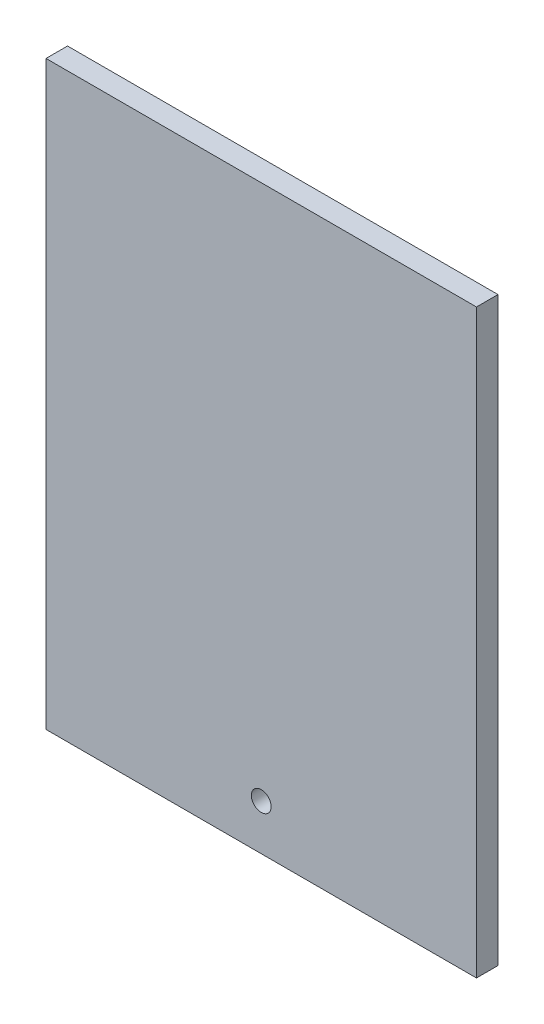
ISO-10303-21;
HEADER;
FILE_DESCRIPTION(('STEP AP214'),'2;1');
FILE_NAME('part.step','',(''),(''),'','','');
FILE_SCHEMA(('AUTOMOTIVE_DESIGN { 1 0 10303 214 1 1 1 1 }'));
ENDSEC;
DATA;
#1=APPLICATION_CONTEXT('core data for automotive mechanical design processes');
#2=APPLICATION_PROTOCOL_DEFINITION('international standard','automotive_design',2000,#1);
#3=PRODUCT_CONTEXT('',#1,'mechanical');
#4=PRODUCT('Part','Part','',(#3));
#5=PRODUCT_RELATED_PRODUCT_CATEGORY('part','',(#4));
#6=PRODUCT_DEFINITION_FORMATION('','',#4);
#7=PRODUCT_DEFINITION_CONTEXT('part definition',#1,'design');
#8=PRODUCT_DEFINITION('design','',#6,#7);
#9=PRODUCT_DEFINITION_SHAPE('','',#8);
#10=(LENGTH_UNIT() NAMED_UNIT(*) SI_UNIT(.MILLI.,.METRE.));
#11=(NAMED_UNIT(*) PLANE_ANGLE_UNIT() SI_UNIT($,.RADIAN.));
#12=(NAMED_UNIT(*) SI_UNIT($,.STERADIAN.) SOLID_ANGLE_UNIT());
#13=UNCERTAINTY_MEASURE_WITH_UNIT(LENGTH_MEASURE(1.E-05),#10,'distance_accuracy_value','');
#14=(GEOMETRIC_REPRESENTATION_CONTEXT(3) GLOBAL_UNCERTAINTY_ASSIGNED_CONTEXT((#13)) GLOBAL_UNIT_ASSIGNED_CONTEXT((#10,
#11,#12)) REPRESENTATION_CONTEXT('',''));
#15=CARTESIAN_POINT('',(0.,0.,0.));
#16=DIRECTION('',(0.,0.,1.));
#17=DIRECTION('',(1.,0.,0.));
#18=AXIS2_PLACEMENT_3D('',#15,#16,#17);
#19=CARTESIAN_POINT('',(63.5,85.725,6.35));
#20=DIRECTION('',(-1.,0.,0.));
#21=DIRECTION('',(0.,-1.,0.));
#22=AXIS2_PLACEMENT_3D('',#19,#20,#21);
#23=PLANE('',#22);
#24=DIRECTION('',(0.,1.,0.));
#25=VECTOR('',#24,1.);
#26=CARTESIAN_POINT('',(63.5,85.725,0.));
#27=LINE('',#26,#25);
#28=CARTESIAN_POINT('',(63.5,-85.725,0.));
#29=VERTEX_POINT('',#28);
#30=CARTESIAN_POINT('',(63.5,85.725,0.));
#31=VERTEX_POINT('',#30);
#32=EDGE_CURVE('E97',#29,#31,#27,.T.);
#33=ORIENTED_EDGE('',*,*,#32,.T.);
#34=DIRECTION('',(0.,0.,-1.));
#35=VECTOR('',#34,1.);
#36=CARTESIAN_POINT('',(63.5,85.725,6.35));
#37=LINE('',#36,#35);
#38=CARTESIAN_POINT('',(63.5,85.725,6.35));
#39=VERTEX_POINT('',#38);
#40=EDGE_CURVE('E11',#39,#31,#37,.T.);
#41=ORIENTED_EDGE('',*,*,#40,.F.);
#42=DIRECTION('',(0.,1.,0.));
#43=VECTOR('',#42,1.);
#44=CARTESIAN_POINT('',(63.5,85.725,6.35));
#45=LINE('',#44,#43);
#46=CARTESIAN_POINT('',(63.5,-85.725,6.35));
#47=VERTEX_POINT('',#46);
#48=EDGE_CURVE('E85',#47,#39,#45,.T.);
#49=ORIENTED_EDGE('',*,*,#48,.F.);
#50=DIRECTION('',(0.,0.,-1.));
#51=VECTOR('',#50,1.);
#52=CARTESIAN_POINT('',(63.5,-85.725,6.35));
#53=LINE('',#52,#51);
#54=EDGE_CURVE('E93',#47,#29,#53,.T.);
#55=ORIENTED_EDGE('',*,*,#54,.T.);
#56=EDGE_LOOP('',(#33,#41,#49,#55));
#57=FACE_BOUND('',#56,.T.);
#58=ADVANCED_FACE('F34',(#57),#23,.F.);
#59=CARTESIAN_POINT('',(-63.5,85.725,6.35));
#60=DIRECTION('',(0.,-1.,0.));
#61=DIRECTION('',(0.,0.,-1.));
#62=AXIS2_PLACEMENT_3D('',#59,#60,#61);
#63=PLANE('',#62);
#64=DIRECTION('',(-1.,0.,0.));
#65=VECTOR('',#64,1.);
#66=CARTESIAN_POINT('',(-63.5,85.725,0.));
#67=LINE('',#66,#65);
#68=CARTESIAN_POINT('',(-63.5,85.725,0.));
#69=VERTEX_POINT('',#68);
#70=EDGE_CURVE('E89',#31,#69,#67,.T.);
#71=ORIENTED_EDGE('',*,*,#70,.T.);
#72=DIRECTION('',(0.,0.,-1.));
#73=VECTOR('',#72,1.);
#74=CARTESIAN_POINT('',(-63.5,85.725,6.35));
#75=LINE('',#74,#73);
#76=CARTESIAN_POINT('',(-63.5,85.725,6.35));
#77=VERTEX_POINT('',#76);
#78=EDGE_CURVE('E42',#77,#69,#75,.T.);
#79=ORIENTED_EDGE('',*,*,#78,.F.);
#80=DIRECTION('',(-1.,0.,0.));
#81=VECTOR('',#80,1.);
#82=CARTESIAN_POINT('',(-63.5,85.725,6.35));
#83=LINE('',#82,#81);
#84=EDGE_CURVE('E80',#39,#77,#83,.T.);
#85=ORIENTED_EDGE('',*,*,#84,.F.);
#86=ORIENTED_EDGE('',*,*,#40,.T.);
#87=EDGE_LOOP('',(#71,#79,#85,#86));
#88=FACE_BOUND('',#87,.T.);
#89=ADVANCED_FACE('F88',(#88),#63,.F.);
#90=CARTESIAN_POINT('',(-63.5,85.725,6.35));
#91=DIRECTION('',(1.,0.,0.));
#92=DIRECTION('',(0.,1.,0.));
#93=AXIS2_PLACEMENT_3D('',#90,#91,#92);
#94=PLANE('',#93);
#95=DIRECTION('',(0.,-1.,0.));
#96=VECTOR('',#95,1.);
#97=CARTESIAN_POINT('',(-63.5,85.725,0.));
#98=LINE('',#97,#96);
#99=CARTESIAN_POINT('',(-63.5,-85.725,0.));
#100=VERTEX_POINT('',#99);
#101=EDGE_CURVE('E67',#69,#100,#98,.T.);
#102=ORIENTED_EDGE('',*,*,#101,.T.);
#103=DIRECTION('',(0.,0.,-1.));
#104=VECTOR('',#103,1.);
#105=CARTESIAN_POINT('',(-63.5,-85.725,6.35));
#106=LINE('',#105,#104);
#107=CARTESIAN_POINT('',(-63.5,-85.725,6.35));
#108=VERTEX_POINT('',#107);
#109=EDGE_CURVE('E90',#108,#100,#106,.T.);
#110=ORIENTED_EDGE('',*,*,#109,.F.);
#111=DIRECTION('',(0.,-1.,0.));
#112=VECTOR('',#111,1.);
#113=CARTESIAN_POINT('',(-63.5,85.725,6.35));
#114=LINE('',#113,#112);
#115=EDGE_CURVE('E83',#77,#108,#114,.T.);
#116=ORIENTED_EDGE('',*,*,#115,.F.);
#117=ORIENTED_EDGE('',*,*,#78,.T.);
#118=EDGE_LOOP('',(#102,#110,#116,#117));
#119=FACE_BOUND('',#118,.T.);
#120=ADVANCED_FACE('F91',(#119),#94,.F.);
#121=CARTESIAN_POINT('',(-63.5,-85.725,6.35));
#122=DIRECTION('',(0.,1.,0.));
#123=DIRECTION('',(0.,0.,1.));
#124=AXIS2_PLACEMENT_3D('',#121,#122,#123);
#125=PLANE('',#124);
#126=DIRECTION('',(1.,0.,0.));
#127=VECTOR('',#126,1.);
#128=CARTESIAN_POINT('',(-63.5,-85.725,0.));
#129=LINE('',#128,#127);
#130=EDGE_CURVE('E73',#100,#29,#129,.T.);
#131=ORIENTED_EDGE('',*,*,#130,.T.);
#132=ORIENTED_EDGE('',*,*,#54,.F.);
#133=DIRECTION('',(1.,0.,0.));
#134=VECTOR('',#133,1.);
#135=CARTESIAN_POINT('',(-63.5,-85.725,6.35));
#136=LINE('',#135,#134);
#137=EDGE_CURVE('E50',#108,#47,#136,.T.);
#138=ORIENTED_EDGE('',*,*,#137,.F.);
#139=ORIENTED_EDGE('',*,*,#109,.T.);
#140=EDGE_LOOP('',(#131,#132,#138,#139));
#141=FACE_BOUND('',#140,.T.);
#142=ADVANCED_FACE('F105',(#141),#125,.F.);
#143=CARTESIAN_POINT('',(0.,0.,6.35));
#144=DIRECTION('',(0.,0.,1.));
#145=DIRECTION('',(1.,0.,0.));
#146=AXIS2_PLACEMENT_3D('',#143,#144,#145);
#147=PLANE('',#146);
#148=CARTESIAN_POINT('',(0.,-72.263,6.35));
#149=DIRECTION('',(0.,0.,1.));
#150=DIRECTION('',(1.,0.,0.));
#151=AXIS2_PLACEMENT_3D('',#148,#149,#150);
#152=CIRCLE('',#151,2.921);
#153=CARTESIAN_POINT('',(2.921,-72.263,6.35));
#154=VERTEX_POINT('',#153);
#155=EDGE_CURVE('E111',#154,#154,#152,.T.);
#156=ORIENTED_EDGE('',*,*,#155,.F.);
#157=EDGE_LOOP('',(#156));
#158=FACE_BOUND('',#157,.T.);
#159=ORIENTED_EDGE('',*,*,#48,.T.);
#160=ORIENTED_EDGE('',*,*,#84,.T.);
#161=ORIENTED_EDGE('',*,*,#115,.T.);
#162=ORIENTED_EDGE('',*,*,#137,.T.);
#163=EDGE_LOOP('',(#159,#160,#161,#162));
#164=FACE_BOUND('',#163,.T.);
#165=ADVANCED_FACE('F81',(#158,#164),#147,.T.);
#166=CARTESIAN_POINT('',(0.,0.,0.));
#167=DIRECTION('',(0.,0.,1.));
#168=DIRECTION('',(1.,0.,0.));
#169=AXIS2_PLACEMENT_3D('',#166,#167,#168);
#170=PLANE('',#169);
#171=CARTESIAN_POINT('',(0.,-72.263,0.));
#172=DIRECTION('',(0.,0.,1.));
#173=DIRECTION('',(1.,0.,0.));
#174=AXIS2_PLACEMENT_3D('',#171,#172,#173);
#175=CIRCLE('',#174,2.921);
#176=CARTESIAN_POINT('',(2.921,-72.263,0.));
#177=VERTEX_POINT('',#176);
#178=EDGE_CURVE('E100',#177,#177,#175,.T.);
#179=ORIENTED_EDGE('',*,*,#178,.T.);
#180=EDGE_LOOP('',(#179));
#181=FACE_BOUND('',#180,.T.);
#182=ORIENTED_EDGE('',*,*,#32,.F.);
#183=ORIENTED_EDGE('',*,*,#130,.F.);
#184=ORIENTED_EDGE('',*,*,#101,.F.);
#185=ORIENTED_EDGE('',*,*,#70,.F.);
#186=EDGE_LOOP('',(#182,#183,#184,#185));
#187=FACE_BOUND('',#186,.T.);
#188=ADVANCED_FACE('F108',(#181,#187),#170,.F.);
#189=CARTESIAN_POINT('',(0.,-72.263,0.));
#190=DIRECTION('',(0.,0.,1.));
#191=DIRECTION('',(1.,0.,0.));
#192=AXIS2_PLACEMENT_3D('',#189,#190,#191);
#193=CYLINDRICAL_SURFACE('',#192,2.921);
#194=ORIENTED_EDGE('',*,*,#178,.F.);
#195=EDGE_LOOP('',(#194));
#196=FACE_BOUND('',#195,.T.);
#197=ORIENTED_EDGE('',*,*,#155,.T.);
#198=EDGE_LOOP('',(#197));
#199=FACE_BOUND('',#198,.T.);
#200=ADVANCED_FACE('F118',(#196,#199),#193,.F.);
#201=CLOSED_SHELL('',(#58,#89,#120,#142,#165,#188,#200));
#202=MANIFOLD_SOLID_BREP('B2',#201);
#203=ADVANCED_BREP_SHAPE_REPRESENTATION('',(#18,#202),#14);
#204=SHAPE_DEFINITION_REPRESENTATION(#9,#203);
ENDSEC;
END-ISO-10303-21;
